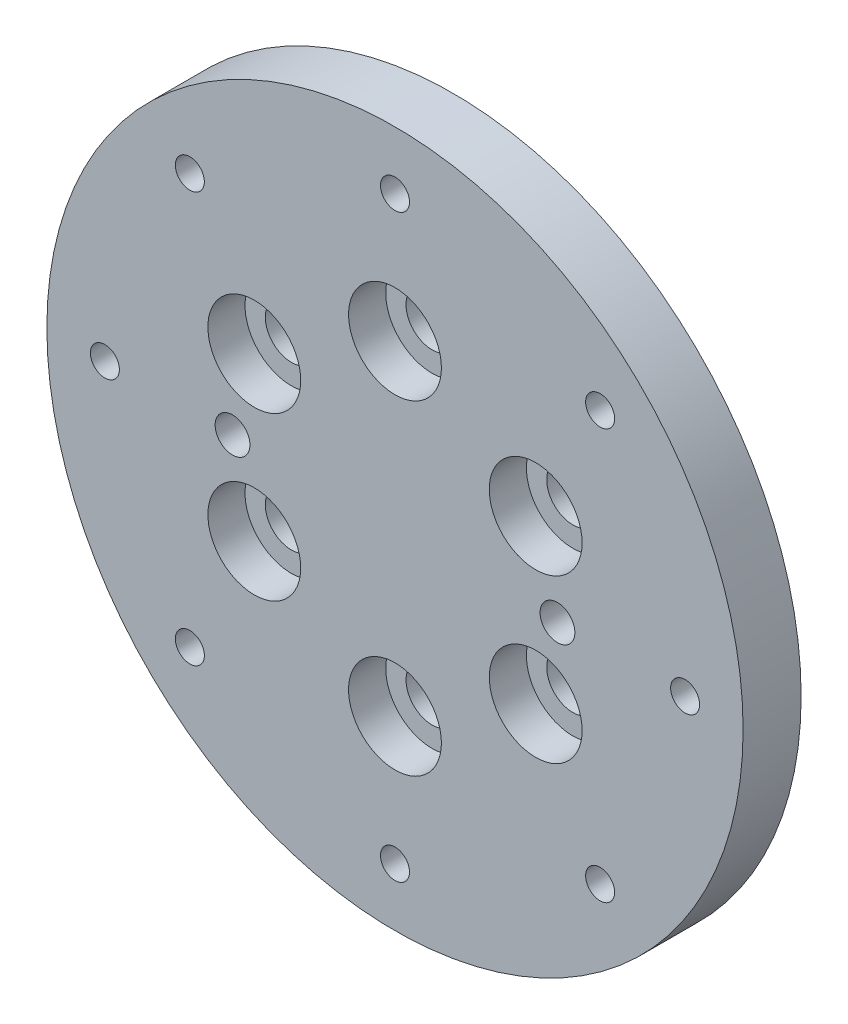
ISO-10303-21;
HEADER;
FILE_DESCRIPTION(('STEP AP214'),'2;1');
FILE_NAME('part.step','',(''),(''),'','','');
FILE_SCHEMA(('AUTOMOTIVE_DESIGN { 1 0 10303 214 1 1 1 1 }'));
ENDSEC;
DATA;
#1=APPLICATION_CONTEXT('core data for automotive mechanical design processes');
#2=APPLICATION_PROTOCOL_DEFINITION('international standard','automotive_design',2000,#1);
#3=PRODUCT_CONTEXT('',#1,'mechanical');
#4=PRODUCT('Part','Part','',(#3));
#5=PRODUCT_RELATED_PRODUCT_CATEGORY('part','',(#4));
#6=PRODUCT_DEFINITION_FORMATION('','',#4);
#7=PRODUCT_DEFINITION_CONTEXT('part definition',#1,'design');
#8=PRODUCT_DEFINITION('design','',#6,#7);
#9=PRODUCT_DEFINITION_SHAPE('','',#8);
#10=(LENGTH_UNIT() NAMED_UNIT(*) SI_UNIT(.MILLI.,.METRE.));
#11=(NAMED_UNIT(*) PLANE_ANGLE_UNIT() SI_UNIT($,.RADIAN.));
#12=(NAMED_UNIT(*) SI_UNIT($,.STERADIAN.) SOLID_ANGLE_UNIT());
#13=UNCERTAINTY_MEASURE_WITH_UNIT(LENGTH_MEASURE(1.E-05),#10,'distance_accuracy_value','');
#14=(GEOMETRIC_REPRESENTATION_CONTEXT(3) GLOBAL_UNCERTAINTY_ASSIGNED_CONTEXT((#13)) GLOBAL_UNIT_ASSIGNED_CONTEXT((#10,
#11,#12)) REPRESENTATION_CONTEXT('',''));
#15=CARTESIAN_POINT('',(0.,0.,0.));
#16=DIRECTION('',(0.,0.,1.));
#17=DIRECTION('',(1.,0.,0.));
#18=AXIS2_PLACEMENT_3D('',#15,#16,#17);
#19=CARTESIAN_POINT('',(0.,0.,5.));
#20=DIRECTION('',(0.,0.,-1.));
#21=DIRECTION('',(-1.,0.,0.));
#22=AXIS2_PLACEMENT_3D('',#19,#20,#21);
#23=CYLINDRICAL_SURFACE('',#22,30.);
#24=CARTESIAN_POINT('',(0.,0.,5.));
#25=DIRECTION('',(0.,0.,1.));
#26=DIRECTION('',(1.,0.,0.));
#27=AXIS2_PLACEMENT_3D('',#24,#25,#26);
#28=CIRCLE('',#27,30.);
#29=CARTESIAN_POINT('',(30.,0.,5.));
#30=VERTEX_POINT('',#29);
#31=EDGE_CURVE('E10',#30,#30,#28,.T.);
#32=ORIENTED_EDGE('',*,*,#31,.F.);
#33=EDGE_LOOP('',(#32));
#34=FACE_BOUND('',#33,.T.);
#35=CARTESIAN_POINT('',(0.,0.,0.));
#36=DIRECTION('',(0.,0.,1.));
#37=DIRECTION('',(1.,0.,0.));
#38=AXIS2_PLACEMENT_3D('',#35,#36,#37);
#39=CIRCLE('',#38,30.);
#40=CARTESIAN_POINT('',(30.,0.,0.));
#41=VERTEX_POINT('',#40);
#42=EDGE_CURVE('E46',#41,#41,#39,.T.);
#43=ORIENTED_EDGE('',*,*,#42,.T.);
#44=EDGE_LOOP('',(#43));
#45=FACE_BOUND('',#44,.T.);
#46=ADVANCED_FACE('F43',(#34,#45),#23,.T.);
#47=CARTESIAN_POINT('',(0.,0.,5.));
#48=DIRECTION('',(0.,0.,1.));
#49=DIRECTION('',(1.,0.,0.));
#50=AXIS2_PLACEMENT_3D('',#47,#48,#49);
#51=PLANE('',#50);
#52=CARTESIAN_POINT('',(0.,25.,5.));
#53=DIRECTION('',(0.,0.,1.));
#54=DIRECTION('',(1.,0.,0.));
#55=AXIS2_PLACEMENT_3D('',#52,#53,#54);
#56=CIRCLE('',#55,1.25);
#57=CARTESIAN_POINT('',(1.25,25.,5.));
#58=VERTEX_POINT('',#57);
#59=EDGE_CURVE('E228',#58,#58,#56,.T.);
#60=ORIENTED_EDGE('',*,*,#59,.F.);
#61=EDGE_LOOP('',(#60));
#62=FACE_BOUND('',#61,.T.);
#63=CARTESIAN_POINT('',(17.677669529664,17.6776695296644,5.));
#64=DIRECTION('',(0.,0.,1.));
#65=DIRECTION('',(1.,0.,0.));
#66=AXIS2_PLACEMENT_3D('',#63,#64,#65);
#67=CIRCLE('',#66,1.25);
#68=CARTESIAN_POINT('',(18.927669529664,17.6776695296644,5.));
#69=VERTEX_POINT('',#68);
#70=EDGE_CURVE('E220',#69,#69,#67,.T.);
#71=ORIENTED_EDGE('',*,*,#70,.F.);
#72=EDGE_LOOP('',(#71));
#73=FACE_BOUND('',#72,.T.);
#74=CARTESIAN_POINT('',(25.0000000000011,1.06122167814335E-12,5.));
#75=DIRECTION('',(0.,0.,1.));
#76=DIRECTION('',(1.,0.,0.));
#77=AXIS2_PLACEMENT_3D('',#74,#75,#76);
#78=CIRCLE('',#77,1.25);
#79=CARTESIAN_POINT('',(26.2500000000011,1.06122167814335E-12,5.));
#80=VERTEX_POINT('',#79);
#81=EDGE_CURVE('E212',#80,#80,#78,.T.);
#82=ORIENTED_EDGE('',*,*,#81,.F.);
#83=EDGE_LOOP('',(#82));
#84=FACE_BOUND('',#83,.T.);
#85=CARTESIAN_POINT('',(17.6776695296655,-17.6776695296629,5.));
#86=DIRECTION('',(0.,0.,1.));
#87=DIRECTION('',(1.,0.,0.));
#88=AXIS2_PLACEMENT_3D('',#85,#86,#87);
#89=CIRCLE('',#88,1.25);
#90=CARTESIAN_POINT('',(18.9276695296655,-17.6776695296629,5.));
#91=VERTEX_POINT('',#90);
#92=EDGE_CURVE('E204',#91,#91,#89,.T.);
#93=ORIENTED_EDGE('',*,*,#92,.F.);
#94=EDGE_LOOP('',(#93));
#95=FACE_BOUND('',#94,.T.);
#96=CARTESIAN_POINT('',(2.1224433562867E-12,-25.,5.));
#97=DIRECTION('',(0.,0.,1.));
#98=DIRECTION('',(1.,0.,0.));
#99=AXIS2_PLACEMENT_3D('',#96,#97,#98);
#100=CIRCLE('',#99,1.25);
#101=CARTESIAN_POINT('',(1.25000000000212,-25.,5.));
#102=VERTEX_POINT('',#101);
#103=EDGE_CURVE('E196',#102,#102,#100,.T.);
#104=ORIENTED_EDGE('',*,*,#103,.F.);
#105=EDGE_LOOP('',(#104));
#106=FACE_BOUND('',#105,.T.);
#107=CARTESIAN_POINT('',(-17.6776695296619,-17.6776695296644,5.));
#108=DIRECTION('',(0.,0.,1.));
#109=DIRECTION('',(1.,0.,0.));
#110=AXIS2_PLACEMENT_3D('',#107,#108,#109);
#111=CIRCLE('',#110,1.25);
#112=CARTESIAN_POINT('',(-16.4276695296619,-17.6776695296644,5.));
#113=VERTEX_POINT('',#112);
#114=EDGE_CURVE('E188',#113,#113,#111,.T.);
#115=ORIENTED_EDGE('',*,*,#114,.F.);
#116=EDGE_LOOP('',(#115));
#117=FACE_BOUND('',#116,.T.);
#118=CARTESIAN_POINT('',(-24.9999999999989,-1.06428329514122E-12,5.));
#119=DIRECTION('',(0.,0.,1.));
#120=DIRECTION('',(1.,0.,0.));
#121=AXIS2_PLACEMENT_3D('',#118,#119,#120);
#122=CIRCLE('',#121,1.25);
#123=CARTESIAN_POINT('',(-23.7499999999989,-1.06428329514122E-12,5.));
#124=VERTEX_POINT('',#123);
#125=EDGE_CURVE('E180',#124,#124,#122,.T.);
#126=ORIENTED_EDGE('',*,*,#125,.F.);
#127=EDGE_LOOP('',(#126));
#128=FACE_BOUND('',#127,.T.);
#129=CARTESIAN_POINT('',(-17.6776695296634,17.6776695296629,5.));
#130=DIRECTION('',(0.,0.,1.));
#131=DIRECTION('',(1.,0.,0.));
#132=AXIS2_PLACEMENT_3D('',#129,#130,#131);
#133=CIRCLE('',#132,1.25);
#134=CARTESIAN_POINT('',(-16.4276695296634,17.6776695296629,5.));
#135=VERTEX_POINT('',#134);
#136=EDGE_CURVE('E172',#135,#135,#133,.T.);
#137=ORIENTED_EDGE('',*,*,#136,.F.);
#138=EDGE_LOOP('',(#137));
#139=FACE_BOUND('',#138,.T.);
#140=CARTESIAN_POINT('',(-14.,0.,5.));
#141=DIRECTION('',(0.,0.,1.));
#142=DIRECTION('',(1.,0.,0.));
#143=AXIS2_PLACEMENT_3D('',#140,#141,#142);
#144=CIRCLE('',#143,1.5);
#145=CARTESIAN_POINT('',(-12.5,0.,5.));
#146=VERTEX_POINT('',#145);
#147=EDGE_CURVE('E164',#146,#146,#144,.T.);
#148=ORIENTED_EDGE('',*,*,#147,.F.);
#149=EDGE_LOOP('',(#148));
#150=FACE_BOUND('',#149,.T.);
#151=CARTESIAN_POINT('',(14.,0.,5.));
#152=DIRECTION('',(0.,0.,1.));
#153=DIRECTION('',(1.,0.,0.));
#154=AXIS2_PLACEMENT_3D('',#151,#152,#153);
#155=CIRCLE('',#154,1.5);
#156=CARTESIAN_POINT('',(15.5,0.,5.));
#157=VERTEX_POINT('',#156);
#158=EDGE_CURVE('E156',#157,#157,#155,.T.);
#159=ORIENTED_EDGE('',*,*,#158,.F.);
#160=EDGE_LOOP('',(#159));
#161=FACE_BOUND('',#160,.T.);
#162=CARTESIAN_POINT('',(0.,14.,5.));
#163=DIRECTION('',(0.,0.,1.));
#164=DIRECTION('',(1.,0.,0.));
#165=AXIS2_PLACEMENT_3D('',#162,#163,#164);
#166=CIRCLE('',#165,4.);
#167=CARTESIAN_POINT('',(4.,14.,5.));
#168=VERTEX_POINT('',#167);
#169=EDGE_CURVE('E148',#168,#168,#166,.T.);
#170=ORIENTED_EDGE('',*,*,#169,.F.);
#171=EDGE_LOOP('',(#170));
#172=FACE_BOUND('',#171,.T.);
#173=CARTESIAN_POINT('',(12.1243556529824,7.00000000000052,5.));
#174=DIRECTION('',(0.,0.,1.));
#175=DIRECTION('',(1.,0.,0.));
#176=AXIS2_PLACEMENT_3D('',#173,#174,#175);
#177=CIRCLE('',#176,4.);
#178=CARTESIAN_POINT('',(16.1243556529824,7.00000000000052,5.));
#179=VERTEX_POINT('',#178);
#180=EDGE_CURVE('E132',#179,#179,#177,.T.);
#181=ORIENTED_EDGE('',*,*,#180,.F.);
#182=EDGE_LOOP('',(#181));
#183=FACE_BOUND('',#182,.T.);
#184=CARTESIAN_POINT('',(12.124355652983,-6.99999999999948,5.));
#185=DIRECTION('',(0.,0.,1.));
#186=DIRECTION('',(1.,0.,0.));
#187=AXIS2_PLACEMENT_3D('',#184,#185,#186);
#188=CIRCLE('',#187,4.);
#189=CARTESIAN_POINT('',(16.124355652983,-6.99999999999948,5.));
#190=VERTEX_POINT('',#189);
#191=EDGE_CURVE('E116',#190,#190,#188,.T.);
#192=ORIENTED_EDGE('',*,*,#191,.F.);
#193=EDGE_LOOP('',(#192));
#194=FACE_BOUND('',#193,.T.);
#195=CARTESIAN_POINT('',(1.18856827952055E-12,-14.,5.));
#196=DIRECTION('',(0.,0.,1.));
#197=DIRECTION('',(1.,0.,0.));
#198=AXIS2_PLACEMENT_3D('',#195,#196,#197);
#199=CIRCLE('',#198,4.);
#200=CARTESIAN_POINT('',(4.00000000000119,-14.,5.));
#201=VERTEX_POINT('',#200);
#202=EDGE_CURVE('E100',#201,#201,#199,.T.);
#203=ORIENTED_EDGE('',*,*,#202,.F.);
#204=EDGE_LOOP('',(#203));
#205=FACE_BOUND('',#204,.T.);
#206=CARTESIAN_POINT('',(-12.1243556529812,-7.00000000000052,5.));
#207=DIRECTION('',(0.,0.,1.));
#208=DIRECTION('',(1.,0.,0.));
#209=AXIS2_PLACEMENT_3D('',#206,#207,#208);
#210=CIRCLE('',#209,4.);
#211=CARTESIAN_POINT('',(-8.12435565298125,-7.00000000000052,5.));
#212=VERTEX_POINT('',#211);
#213=EDGE_CURVE('E84',#212,#212,#210,.T.);
#214=ORIENTED_EDGE('',*,*,#213,.F.);
#215=EDGE_LOOP('',(#214));
#216=FACE_BOUND('',#215,.T.);
#217=CARTESIAN_POINT('',(-12.1243556529818,6.99999999999949,5.));
#218=DIRECTION('',(0.,0.,1.));
#219=DIRECTION('',(1.,0.,0.));
#220=AXIS2_PLACEMENT_3D('',#217,#218,#219);
#221=CIRCLE('',#220,4.);
#222=CARTESIAN_POINT('',(-8.12435565298185,6.99999999999949,5.));
#223=VERTEX_POINT('',#222);
#224=EDGE_CURVE('E68',#223,#223,#221,.T.);
#225=ORIENTED_EDGE('',*,*,#224,.F.);
#226=EDGE_LOOP('',(#225));
#227=FACE_BOUND('',#226,.T.);
#228=ORIENTED_EDGE('',*,*,#31,.T.);
#229=EDGE_LOOP('',(#228));
#230=FACE_BOUND('',#229,.T.);
#231=ADVANCED_FACE('F235',(#62,#73,#84,#95,#106,#117,#128,#139,#150,#161,#172,#183,#194,#205,
#216,#227,#230),#51,.T.);
#232=CARTESIAN_POINT('',(0.,0.,0.));
#233=DIRECTION('',(0.,0.,1.));
#234=DIRECTION('',(1.,0.,0.));
#235=AXIS2_PLACEMENT_3D('',#232,#233,#234);
#236=PLANE('',#235);
#237=CARTESIAN_POINT('',(0.,25.,0.));
#238=DIRECTION('',(0.,0.,1.));
#239=DIRECTION('',(1.,0.,0.));
#240=AXIS2_PLACEMENT_3D('',#237,#238,#239);
#241=CIRCLE('',#240,1.25);
#242=CARTESIAN_POINT('',(1.25,25.,0.));
#243=VERTEX_POINT('',#242);
#244=EDGE_CURVE('E224',#243,#243,#241,.T.);
#245=ORIENTED_EDGE('',*,*,#244,.T.);
#246=EDGE_LOOP('',(#245));
#247=FACE_BOUND('',#246,.T.);
#248=CARTESIAN_POINT('',(17.677669529664,17.6776695296644,0.));
#249=DIRECTION('',(0.,0.,1.));
#250=DIRECTION('',(1.,0.,0.));
#251=AXIS2_PLACEMENT_3D('',#248,#249,#250);
#252=CIRCLE('',#251,1.25);
#253=CARTESIAN_POINT('',(18.927669529664,17.6776695296644,0.));
#254=VERTEX_POINT('',#253);
#255=EDGE_CURVE('E216',#254,#254,#252,.T.);
#256=ORIENTED_EDGE('',*,*,#255,.T.);
#257=EDGE_LOOP('',(#256));
#258=FACE_BOUND('',#257,.T.);
#259=CARTESIAN_POINT('',(25.0000000000011,1.06122167814335E-12,0.));
#260=DIRECTION('',(0.,0.,1.));
#261=DIRECTION('',(1.,0.,0.));
#262=AXIS2_PLACEMENT_3D('',#259,#260,#261);
#263=CIRCLE('',#262,1.25);
#264=CARTESIAN_POINT('',(26.2500000000011,1.06122167814335E-12,0.));
#265=VERTEX_POINT('',#264);
#266=EDGE_CURVE('E208',#265,#265,#263,.T.);
#267=ORIENTED_EDGE('',*,*,#266,.T.);
#268=EDGE_LOOP('',(#267));
#269=FACE_BOUND('',#268,.T.);
#270=CARTESIAN_POINT('',(17.6776695296655,-17.6776695296629,0.));
#271=DIRECTION('',(0.,0.,1.));
#272=DIRECTION('',(1.,0.,0.));
#273=AXIS2_PLACEMENT_3D('',#270,#271,#272);
#274=CIRCLE('',#273,1.25);
#275=CARTESIAN_POINT('',(18.9276695296655,-17.6776695296629,0.));
#276=VERTEX_POINT('',#275);
#277=EDGE_CURVE('E200',#276,#276,#274,.T.);
#278=ORIENTED_EDGE('',*,*,#277,.T.);
#279=EDGE_LOOP('',(#278));
#280=FACE_BOUND('',#279,.T.);
#281=CARTESIAN_POINT('',(2.1224433562867E-12,-25.,0.));
#282=DIRECTION('',(0.,0.,1.));
#283=DIRECTION('',(1.,0.,0.));
#284=AXIS2_PLACEMENT_3D('',#281,#282,#283);
#285=CIRCLE('',#284,1.25);
#286=CARTESIAN_POINT('',(1.25000000000212,-25.,0.));
#287=VERTEX_POINT('',#286);
#288=EDGE_CURVE('E192',#287,#287,#285,.T.);
#289=ORIENTED_EDGE('',*,*,#288,.T.);
#290=EDGE_LOOP('',(#289));
#291=FACE_BOUND('',#290,.T.);
#292=CARTESIAN_POINT('',(-17.6776695296619,-17.6776695296644,0.));
#293=DIRECTION('',(0.,0.,1.));
#294=DIRECTION('',(1.,0.,0.));
#295=AXIS2_PLACEMENT_3D('',#292,#293,#294);
#296=CIRCLE('',#295,1.25);
#297=CARTESIAN_POINT('',(-16.4276695296619,-17.6776695296644,0.));
#298=VERTEX_POINT('',#297);
#299=EDGE_CURVE('E184',#298,#298,#296,.T.);
#300=ORIENTED_EDGE('',*,*,#299,.T.);
#301=EDGE_LOOP('',(#300));
#302=FACE_BOUND('',#301,.T.);
#303=CARTESIAN_POINT('',(-24.9999999999989,-1.06428329514122E-12,0.));
#304=DIRECTION('',(0.,0.,1.));
#305=DIRECTION('',(1.,0.,0.));
#306=AXIS2_PLACEMENT_3D('',#303,#304,#305);
#307=CIRCLE('',#306,1.25);
#308=CARTESIAN_POINT('',(-23.7499999999989,-1.06428329514122E-12,0.));
#309=VERTEX_POINT('',#308);
#310=EDGE_CURVE('E176',#309,#309,#307,.T.);
#311=ORIENTED_EDGE('',*,*,#310,.T.);
#312=EDGE_LOOP('',(#311));
#313=FACE_BOUND('',#312,.T.);
#314=CARTESIAN_POINT('',(-17.6776695296634,17.6776695296629,0.));
#315=DIRECTION('',(0.,0.,1.));
#316=DIRECTION('',(1.,0.,0.));
#317=AXIS2_PLACEMENT_3D('',#314,#315,#316);
#318=CIRCLE('',#317,1.25);
#319=CARTESIAN_POINT('',(-16.4276695296634,17.6776695296629,0.));
#320=VERTEX_POINT('',#319);
#321=EDGE_CURVE('E168',#320,#320,#318,.T.);
#322=ORIENTED_EDGE('',*,*,#321,.T.);
#323=EDGE_LOOP('',(#322));
#324=FACE_BOUND('',#323,.T.);
#325=CARTESIAN_POINT('',(-14.,0.,0.));
#326=DIRECTION('',(0.,0.,1.));
#327=DIRECTION('',(1.,0.,0.));
#328=AXIS2_PLACEMENT_3D('',#325,#326,#327);
#329=CIRCLE('',#328,1.5);
#330=CARTESIAN_POINT('',(-12.5,0.,0.));
#331=VERTEX_POINT('',#330);
#332=EDGE_CURVE('E160',#331,#331,#329,.T.);
#333=ORIENTED_EDGE('',*,*,#332,.T.);
#334=EDGE_LOOP('',(#333));
#335=FACE_BOUND('',#334,.T.);
#336=CARTESIAN_POINT('',(14.,0.,0.));
#337=DIRECTION('',(0.,0.,1.));
#338=DIRECTION('',(1.,0.,0.));
#339=AXIS2_PLACEMENT_3D('',#336,#337,#338);
#340=CIRCLE('',#339,1.5);
#341=CARTESIAN_POINT('',(15.5,0.,0.));
#342=VERTEX_POINT('',#341);
#343=EDGE_CURVE('E152',#342,#342,#340,.T.);
#344=ORIENTED_EDGE('',*,*,#343,.T.);
#345=EDGE_LOOP('',(#344));
#346=FACE_BOUND('',#345,.T.);
#347=CARTESIAN_POINT('',(0.,14.,0.));
#348=DIRECTION('',(0.,0.,1.));
#349=DIRECTION('',(1.,0.,0.));
#350=AXIS2_PLACEMENT_3D('',#347,#348,#349);
#351=CIRCLE('',#350,2.25);
#352=CARTESIAN_POINT('',(2.25,14.,0.));
#353=VERTEX_POINT('',#352);
#354=EDGE_CURVE('E136',#353,#353,#351,.T.);
#355=ORIENTED_EDGE('',*,*,#354,.T.);
#356=EDGE_LOOP('',(#355));
#357=FACE_BOUND('',#356,.T.);
#358=CARTESIAN_POINT('',(12.1243556529824,7.00000000000052,0.));
#359=DIRECTION('',(0.,0.,1.));
#360=DIRECTION('',(1.,0.,0.));
#361=AXIS2_PLACEMENT_3D('',#358,#359,#360);
#362=CIRCLE('',#361,2.25);
#363=CARTESIAN_POINT('',(14.3743556529824,7.00000000000052,0.));
#364=VERTEX_POINT('',#363);
#365=EDGE_CURVE('E120',#364,#364,#362,.T.);
#366=ORIENTED_EDGE('',*,*,#365,.T.);
#367=EDGE_LOOP('',(#366));
#368=FACE_BOUND('',#367,.T.);
#369=CARTESIAN_POINT('',(12.124355652983,-6.99999999999948,0.));
#370=DIRECTION('',(0.,0.,1.));
#371=DIRECTION('',(1.,0.,0.));
#372=AXIS2_PLACEMENT_3D('',#369,#370,#371);
#373=CIRCLE('',#372,2.25);
#374=CARTESIAN_POINT('',(14.374355652983,-6.99999999999948,0.));
#375=VERTEX_POINT('',#374);
#376=EDGE_CURVE('E104',#375,#375,#373,.T.);
#377=ORIENTED_EDGE('',*,*,#376,.T.);
#378=EDGE_LOOP('',(#377));
#379=FACE_BOUND('',#378,.T.);
#380=CARTESIAN_POINT('',(1.18856827952055E-12,-14.,0.));
#381=DIRECTION('',(0.,0.,1.));
#382=DIRECTION('',(1.,0.,0.));
#383=AXIS2_PLACEMENT_3D('',#380,#381,#382);
#384=CIRCLE('',#383,2.25);
#385=CARTESIAN_POINT('',(2.25000000000119,-14.,0.));
#386=VERTEX_POINT('',#385);
#387=EDGE_CURVE('E88',#386,#386,#384,.T.);
#388=ORIENTED_EDGE('',*,*,#387,.T.);
#389=EDGE_LOOP('',(#388));
#390=FACE_BOUND('',#389,.T.);
#391=CARTESIAN_POINT('',(-12.1243556529812,-7.00000000000052,0.));
#392=DIRECTION('',(0.,0.,1.));
#393=DIRECTION('',(1.,0.,0.));
#394=AXIS2_PLACEMENT_3D('',#391,#392,#393);
#395=CIRCLE('',#394,2.25);
#396=CARTESIAN_POINT('',(-9.87435565298125,-7.00000000000052,0.));
#397=VERTEX_POINT('',#396);
#398=EDGE_CURVE('E72',#397,#397,#395,.T.);
#399=ORIENTED_EDGE('',*,*,#398,.T.);
#400=EDGE_LOOP('',(#399));
#401=FACE_BOUND('',#400,.T.);
#402=CARTESIAN_POINT('',(-12.1243556529818,6.99999999999949,0.));
#403=DIRECTION('',(0.,0.,1.));
#404=DIRECTION('',(1.,0.,0.));
#405=AXIS2_PLACEMENT_3D('',#402,#403,#404);
#406=CIRCLE('',#405,2.25);
#407=CARTESIAN_POINT('',(-9.87435565298185,6.99999999999949,0.));
#408=VERTEX_POINT('',#407);
#409=EDGE_CURVE('E55',#408,#408,#406,.T.);
#410=ORIENTED_EDGE('',*,*,#409,.T.);
#411=EDGE_LOOP('',(#410));
#412=FACE_BOUND('',#411,.T.);
#413=ORIENTED_EDGE('',*,*,#42,.F.);
#414=EDGE_LOOP('',(#413));
#415=FACE_BOUND('',#414,.T.);
#416=ADVANCED_FACE('F238',(#247,#258,#269,#280,#291,#302,#313,#324,#335,#346,#357,#368,#379,
#390,#401,#412,#415),#236,.F.);
#417=CARTESIAN_POINT('',(-12.1243556529818,6.99999999999949,5.));
#418=DIRECTION('',(0.,0.,1.));
#419=DIRECTION('',(1.,0.,0.));
#420=AXIS2_PLACEMENT_3D('',#417,#418,#419);
#421=CYLINDRICAL_SURFACE('',#420,2.25);
#422=ORIENTED_EDGE('',*,*,#409,.F.);
#423=EDGE_LOOP('',(#422));
#424=FACE_BOUND('',#423,.T.);
#425=CARTESIAN_POINT('',(-12.1243556529818,6.99999999999949,1.8));
#426=DIRECTION('',(0.,0.,1.));
#427=DIRECTION('',(1.,0.,0.));
#428=AXIS2_PLACEMENT_3D('',#425,#426,#427);
#429=CIRCLE('',#428,2.25);
#430=CARTESIAN_POINT('',(-9.87435565298185,6.99999999999949,1.8));
#431=VERTEX_POINT('',#430);
#432=EDGE_CURVE('E60',#431,#431,#429,.T.);
#433=ORIENTED_EDGE('',*,*,#432,.T.);
#434=EDGE_LOOP('',(#433));
#435=FACE_BOUND('',#434,.T.);
#436=ADVANCED_FACE('F283',(#424,#435),#421,.F.);
#437=CARTESIAN_POINT('',(-9.87435565298185,6.99999999999949,1.8));
#438=DIRECTION('',(0.,0.,-1.));
#439=DIRECTION('',(-1.,0.,0.));
#440=AXIS2_PLACEMENT_3D('',#437,#438,#439);
#441=PLANE('',#440);
#442=ORIENTED_EDGE('',*,*,#432,.F.);
#443=EDGE_LOOP('',(#442));
#444=FACE_BOUND('',#443,.T.);
#445=CARTESIAN_POINT('',(-12.1243556529818,6.99999999999949,1.8));
#446=DIRECTION('',(0.,0.,1.));
#447=DIRECTION('',(1.,0.,0.));
#448=AXIS2_PLACEMENT_3D('',#445,#446,#447);
#449=CIRCLE('',#448,4.);
#450=CARTESIAN_POINT('',(-8.12435565298185,6.99999999999949,1.8));
#451=VERTEX_POINT('',#450);
#452=EDGE_CURVE('E64',#451,#451,#449,.T.);
#453=ORIENTED_EDGE('',*,*,#452,.T.);
#454=EDGE_LOOP('',(#453));
#455=FACE_BOUND('',#454,.T.);
#456=ADVANCED_FACE('F273',(#444,#455),#441,.F.);
#457=CARTESIAN_POINT('',(-12.1243556529818,6.99999999999949,5.));
#458=DIRECTION('',(0.,0.,1.));
#459=DIRECTION('',(1.,0.,0.));
#460=AXIS2_PLACEMENT_3D('',#457,#458,#459);
#461=CYLINDRICAL_SURFACE('',#460,4.);
#462=ORIENTED_EDGE('',*,*,#452,.F.);
#463=EDGE_LOOP('',(#462));
#464=FACE_BOUND('',#463,.T.);
#465=ORIENTED_EDGE('',*,*,#224,.T.);
#466=EDGE_LOOP('',(#465));
#467=FACE_BOUND('',#466,.T.);
#468=ADVANCED_FACE('F270',(#464,#467),#461,.F.);
#469=CARTESIAN_POINT('',(-12.1243556529812,-7.00000000000052,5.));
#470=DIRECTION('',(0.,0.,1.));
#471=DIRECTION('',(1.,0.,0.));
#472=AXIS2_PLACEMENT_3D('',#469,#470,#471);
#473=CYLINDRICAL_SURFACE('',#472,2.25);
#474=ORIENTED_EDGE('',*,*,#398,.F.);
#475=EDGE_LOOP('',(#474));
#476=FACE_BOUND('',#475,.T.);
#477=CARTESIAN_POINT('',(-12.1243556529812,-7.00000000000052,1.8));
#478=DIRECTION('',(0.,0.,1.));
#479=DIRECTION('',(1.,0.,0.));
#480=AXIS2_PLACEMENT_3D('',#477,#478,#479);
#481=CIRCLE('',#480,2.25);
#482=CARTESIAN_POINT('',(-9.87435565298125,-7.00000000000052,1.8));
#483=VERTEX_POINT('',#482);
#484=EDGE_CURVE('E76',#483,#483,#481,.T.);
#485=ORIENTED_EDGE('',*,*,#484,.T.);
#486=EDGE_LOOP('',(#485));
#487=FACE_BOUND('',#486,.T.);
#488=ADVANCED_FACE('F272',(#476,#487),#473,.F.);
#489=CARTESIAN_POINT('',(-9.87435565298125,-7.00000000000052,1.8));
#490=DIRECTION('',(0.,0.,-1.));
#491=DIRECTION('',(-1.,0.,0.));
#492=AXIS2_PLACEMENT_3D('',#489,#490,#491);
#493=PLANE('',#492);
#494=ORIENTED_EDGE('',*,*,#484,.F.);
#495=EDGE_LOOP('',(#494));
#496=FACE_BOUND('',#495,.T.);
#497=CARTESIAN_POINT('',(-12.1243556529812,-7.00000000000052,1.8));
#498=DIRECTION('',(0.,0.,1.));
#499=DIRECTION('',(1.,0.,0.));
#500=AXIS2_PLACEMENT_3D('',#497,#498,#499);
#501=CIRCLE('',#500,4.);
#502=CARTESIAN_POINT('',(-8.12435565298125,-7.00000000000052,1.8));
#503=VERTEX_POINT('',#502);
#504=EDGE_CURVE('E80',#503,#503,#501,.T.);
#505=ORIENTED_EDGE('',*,*,#504,.T.);
#506=EDGE_LOOP('',(#505));
#507=FACE_BOUND('',#506,.T.);
#508=ADVANCED_FACE('F280',(#496,#507),#493,.F.);
#509=CARTESIAN_POINT('',(-12.1243556529812,-7.00000000000052,5.));
#510=DIRECTION('',(0.,0.,1.));
#511=DIRECTION('',(1.,0.,0.));
#512=AXIS2_PLACEMENT_3D('',#509,#510,#511);
#513=CYLINDRICAL_SURFACE('',#512,4.);
#514=ORIENTED_EDGE('',*,*,#504,.F.);
#515=EDGE_LOOP('',(#514));
#516=FACE_BOUND('',#515,.T.);
#517=ORIENTED_EDGE('',*,*,#213,.T.);
#518=EDGE_LOOP('',(#517));
#519=FACE_BOUND('',#518,.T.);
#520=ADVANCED_FACE('F341',(#516,#519),#513,.F.);
#521=CARTESIAN_POINT('',(1.18856827952055E-12,-14.,5.));
#522=DIRECTION('',(0.,0.,1.));
#523=DIRECTION('',(1.,0.,0.));
#524=AXIS2_PLACEMENT_3D('',#521,#522,#523);
#525=CYLINDRICAL_SURFACE('',#524,2.25);
#526=ORIENTED_EDGE('',*,*,#387,.F.);
#527=EDGE_LOOP('',(#526));
#528=FACE_BOUND('',#527,.T.);
#529=CARTESIAN_POINT('',(1.18856827952055E-12,-14.,1.8));
#530=DIRECTION('',(0.,0.,1.));
#531=DIRECTION('',(1.,0.,0.));
#532=AXIS2_PLACEMENT_3D('',#529,#530,#531);
#533=CIRCLE('',#532,2.25);
#534=CARTESIAN_POINT('',(2.25000000000119,-14.,1.8));
#535=VERTEX_POINT('',#534);
#536=EDGE_CURVE('E92',#535,#535,#533,.T.);
#537=ORIENTED_EDGE('',*,*,#536,.T.);
#538=EDGE_LOOP('',(#537));
#539=FACE_BOUND('',#538,.T.);
#540=ADVANCED_FACE('F347',(#528,#539),#525,.F.);
#541=CARTESIAN_POINT('',(2.25000000000119,-14.,1.8));
#542=DIRECTION('',(0.,0.,-1.));
#543=DIRECTION('',(-1.,0.,0.));
#544=AXIS2_PLACEMENT_3D('',#541,#542,#543);
#545=PLANE('',#544);
#546=ORIENTED_EDGE('',*,*,#536,.F.);
#547=EDGE_LOOP('',(#546));
#548=FACE_BOUND('',#547,.T.);
#549=CARTESIAN_POINT('',(1.18856827952055E-12,-14.,1.8));
#550=DIRECTION('',(0.,0.,1.));
#551=DIRECTION('',(1.,0.,0.));
#552=AXIS2_PLACEMENT_3D('',#549,#550,#551);
#553=CIRCLE('',#552,4.);
#554=CARTESIAN_POINT('',(4.00000000000119,-14.,1.8));
#555=VERTEX_POINT('',#554);
#556=EDGE_CURVE('E96',#555,#555,#553,.T.);
#557=ORIENTED_EDGE('',*,*,#556,.T.);
#558=EDGE_LOOP('',(#557));
#559=FACE_BOUND('',#558,.T.);
#560=ADVANCED_FACE('F352',(#548,#559),#545,.F.);
#561=CARTESIAN_POINT('',(1.18856827952055E-12,-14.,5.));
#562=DIRECTION('',(0.,0.,1.));
#563=DIRECTION('',(1.,0.,0.));
#564=AXIS2_PLACEMENT_3D('',#561,#562,#563);
#565=CYLINDRICAL_SURFACE('',#564,4.);
#566=ORIENTED_EDGE('',*,*,#556,.F.);
#567=EDGE_LOOP('',(#566));
#568=FACE_BOUND('',#567,.T.);
#569=ORIENTED_EDGE('',*,*,#202,.T.);
#570=EDGE_LOOP('',(#569));
#571=FACE_BOUND('',#570,.T.);
#572=ADVANCED_FACE('F358',(#568,#571),#565,.F.);
#573=CARTESIAN_POINT('',(12.124355652983,-6.99999999999948,5.));
#574=DIRECTION('',(0.,0.,1.));
#575=DIRECTION('',(1.,0.,0.));
#576=AXIS2_PLACEMENT_3D('',#573,#574,#575);
#577=CYLINDRICAL_SURFACE('',#576,2.25);
#578=ORIENTED_EDGE('',*,*,#376,.F.);
#579=EDGE_LOOP('',(#578));
#580=FACE_BOUND('',#579,.T.);
#581=CARTESIAN_POINT('',(12.124355652983,-6.99999999999948,1.8));
#582=DIRECTION('',(0.,0.,1.));
#583=DIRECTION('',(1.,0.,0.));
#584=AXIS2_PLACEMENT_3D('',#581,#582,#583);
#585=CIRCLE('',#584,2.25);
#586=CARTESIAN_POINT('',(14.374355652983,-6.99999999999948,1.8));
#587=VERTEX_POINT('',#586);
#588=EDGE_CURVE('E108',#587,#587,#585,.T.);
#589=ORIENTED_EDGE('',*,*,#588,.T.);
#590=EDGE_LOOP('',(#589));
#591=FACE_BOUND('',#590,.T.);
#592=ADVANCED_FACE('F362',(#580,#591),#577,.F.);
#593=CARTESIAN_POINT('',(14.374355652983,-6.99999999999948,1.8));
#594=DIRECTION('',(0.,0.,-1.));
#595=DIRECTION('',(-1.,0.,0.));
#596=AXIS2_PLACEMENT_3D('',#593,#594,#595);
#597=PLANE('',#596);
#598=ORIENTED_EDGE('',*,*,#588,.F.);
#599=EDGE_LOOP('',(#598));
#600=FACE_BOUND('',#599,.T.);
#601=CARTESIAN_POINT('',(12.124355652983,-6.99999999999948,1.8));
#602=DIRECTION('',(0.,0.,1.));
#603=DIRECTION('',(1.,0.,0.));
#604=AXIS2_PLACEMENT_3D('',#601,#602,#603);
#605=CIRCLE('',#604,4.);
#606=CARTESIAN_POINT('',(16.124355652983,-6.99999999999948,1.8));
#607=VERTEX_POINT('',#606);
#608=EDGE_CURVE('E112',#607,#607,#605,.T.);
#609=ORIENTED_EDGE('',*,*,#608,.T.);
#610=EDGE_LOOP('',(#609));
#611=FACE_BOUND('',#610,.T.);
#612=ADVANCED_FACE('F366',(#600,#611),#597,.F.);
#613=CARTESIAN_POINT('',(12.124355652983,-6.99999999999948,5.));
#614=DIRECTION('',(0.,0.,1.));
#615=DIRECTION('',(1.,0.,0.));
#616=AXIS2_PLACEMENT_3D('',#613,#614,#615);
#617=CYLINDRICAL_SURFACE('',#616,4.);
#618=ORIENTED_EDGE('',*,*,#608,.F.);
#619=EDGE_LOOP('',(#618));
#620=FACE_BOUND('',#619,.T.);
#621=ORIENTED_EDGE('',*,*,#191,.T.);
#622=EDGE_LOOP('',(#621));
#623=FACE_BOUND('',#622,.T.);
#624=ADVANCED_FACE('F370',(#620,#623),#617,.F.);
#625=CARTESIAN_POINT('',(12.1243556529824,7.00000000000052,5.));
#626=DIRECTION('',(0.,0.,1.));
#627=DIRECTION('',(1.,0.,0.));
#628=AXIS2_PLACEMENT_3D('',#625,#626,#627);
#629=CYLINDRICAL_SURFACE('',#628,2.25);
#630=ORIENTED_EDGE('',*,*,#365,.F.);
#631=EDGE_LOOP('',(#630));
#632=FACE_BOUND('',#631,.T.);
#633=CARTESIAN_POINT('',(12.1243556529824,7.00000000000052,1.8));
#634=DIRECTION('',(0.,0.,1.));
#635=DIRECTION('',(1.,0.,0.));
#636=AXIS2_PLACEMENT_3D('',#633,#634,#635);
#637=CIRCLE('',#636,2.25);
#638=CARTESIAN_POINT('',(14.3743556529824,7.00000000000052,1.8));
#639=VERTEX_POINT('',#638);
#640=EDGE_CURVE('E124',#639,#639,#637,.T.);
#641=ORIENTED_EDGE('',*,*,#640,.T.);
#642=EDGE_LOOP('',(#641));
#643=FACE_BOUND('',#642,.T.);
#644=ADVANCED_FACE('F374',(#632,#643),#629,.F.);
#645=CARTESIAN_POINT('',(14.3743556529824,7.00000000000052,1.8));
#646=DIRECTION('',(0.,0.,-1.));
#647=DIRECTION('',(-1.,0.,0.));
#648=AXIS2_PLACEMENT_3D('',#645,#646,#647);
#649=PLANE('',#648);
#650=ORIENTED_EDGE('',*,*,#640,.F.);
#651=EDGE_LOOP('',(#650));
#652=FACE_BOUND('',#651,.T.);
#653=CARTESIAN_POINT('',(12.1243556529824,7.00000000000052,1.8));
#654=DIRECTION('',(0.,0.,1.));
#655=DIRECTION('',(1.,0.,0.));
#656=AXIS2_PLACEMENT_3D('',#653,#654,#655);
#657=CIRCLE('',#656,4.);
#658=CARTESIAN_POINT('',(16.1243556529824,7.00000000000052,1.8));
#659=VERTEX_POINT('',#658);
#660=EDGE_CURVE('E128',#659,#659,#657,.T.);
#661=ORIENTED_EDGE('',*,*,#660,.T.);
#662=EDGE_LOOP('',(#661));
#663=FACE_BOUND('',#662,.T.);
#664=ADVANCED_FACE('F378',(#652,#663),#649,.F.);
#665=CARTESIAN_POINT('',(12.1243556529824,7.00000000000052,5.));
#666=DIRECTION('',(0.,0.,1.));
#667=DIRECTION('',(1.,0.,0.));
#668=AXIS2_PLACEMENT_3D('',#665,#666,#667);
#669=CYLINDRICAL_SURFACE('',#668,4.);
#670=ORIENTED_EDGE('',*,*,#660,.F.);
#671=EDGE_LOOP('',(#670));
#672=FACE_BOUND('',#671,.T.);
#673=ORIENTED_EDGE('',*,*,#180,.T.);
#674=EDGE_LOOP('',(#673));
#675=FACE_BOUND('',#674,.T.);
#676=ADVANCED_FACE('F382',(#672,#675),#669,.F.);
#677=CARTESIAN_POINT('',(0.,14.,5.));
#678=DIRECTION('',(0.,0.,1.));
#679=DIRECTION('',(1.,0.,0.));
#680=AXIS2_PLACEMENT_3D('',#677,#678,#679);
#681=CYLINDRICAL_SURFACE('',#680,2.25);
#682=ORIENTED_EDGE('',*,*,#354,.F.);
#683=EDGE_LOOP('',(#682));
#684=FACE_BOUND('',#683,.T.);
#685=CARTESIAN_POINT('',(0.,14.,1.8));
#686=DIRECTION('',(0.,0.,1.));
#687=DIRECTION('',(1.,0.,0.));
#688=AXIS2_PLACEMENT_3D('',#685,#686,#687);
#689=CIRCLE('',#688,2.25);
#690=CARTESIAN_POINT('',(2.25,14.,1.8));
#691=VERTEX_POINT('',#690);
#692=EDGE_CURVE('E140',#691,#691,#689,.T.);
#693=ORIENTED_EDGE('',*,*,#692,.T.);
#694=EDGE_LOOP('',(#693));
#695=FACE_BOUND('',#694,.T.);
#696=ADVANCED_FACE('F386',(#684,#695),#681,.F.);
#697=CARTESIAN_POINT('',(2.25,14.,1.8));
#698=DIRECTION('',(0.,0.,-1.));
#699=DIRECTION('',(-1.,0.,0.));
#700=AXIS2_PLACEMENT_3D('',#697,#698,#699);
#701=PLANE('',#700);
#702=ORIENTED_EDGE('',*,*,#692,.F.);
#703=EDGE_LOOP('',(#702));
#704=FACE_BOUND('',#703,.T.);
#705=CARTESIAN_POINT('',(0.,14.,1.8));
#706=DIRECTION('',(0.,0.,1.));
#707=DIRECTION('',(1.,0.,0.));
#708=AXIS2_PLACEMENT_3D('',#705,#706,#707);
#709=CIRCLE('',#708,4.);
#710=CARTESIAN_POINT('',(4.,14.,1.8));
#711=VERTEX_POINT('',#710);
#712=EDGE_CURVE('E144',#711,#711,#709,.T.);
#713=ORIENTED_EDGE('',*,*,#712,.T.);
#714=EDGE_LOOP('',(#713));
#715=FACE_BOUND('',#714,.T.);
#716=ADVANCED_FACE('F390',(#704,#715),#701,.F.);
#717=CARTESIAN_POINT('',(0.,14.,5.));
#718=DIRECTION('',(0.,0.,1.));
#719=DIRECTION('',(1.,0.,0.));
#720=AXIS2_PLACEMENT_3D('',#717,#718,#719);
#721=CYLINDRICAL_SURFACE('',#720,4.);
#722=ORIENTED_EDGE('',*,*,#712,.F.);
#723=EDGE_LOOP('',(#722));
#724=FACE_BOUND('',#723,.T.);
#725=ORIENTED_EDGE('',*,*,#169,.T.);
#726=EDGE_LOOP('',(#725));
#727=FACE_BOUND('',#726,.T.);
#728=ADVANCED_FACE('F394',(#724,#727),#721,.F.);
#729=CARTESIAN_POINT('',(14.,0.,5.));
#730=DIRECTION('',(0.,0.,1.));
#731=DIRECTION('',(1.,0.,0.));
#732=AXIS2_PLACEMENT_3D('',#729,#730,#731);
#733=CYLINDRICAL_SURFACE('',#732,1.5);
#734=ORIENTED_EDGE('',*,*,#343,.F.);
#735=EDGE_LOOP('',(#734));
#736=FACE_BOUND('',#735,.T.);
#737=ORIENTED_EDGE('',*,*,#158,.T.);
#738=EDGE_LOOP('',(#737));
#739=FACE_BOUND('',#738,.T.);
#740=ADVANCED_FACE('F398',(#736,#739),#733,.F.);
#741=CARTESIAN_POINT('',(-14.,0.,5.));
#742=DIRECTION('',(0.,0.,1.));
#743=DIRECTION('',(1.,0.,0.));
#744=AXIS2_PLACEMENT_3D('',#741,#742,#743);
#745=CYLINDRICAL_SURFACE('',#744,1.5);
#746=ORIENTED_EDGE('',*,*,#332,.F.);
#747=EDGE_LOOP('',(#746));
#748=FACE_BOUND('',#747,.T.);
#749=ORIENTED_EDGE('',*,*,#147,.T.);
#750=EDGE_LOOP('',(#749));
#751=FACE_BOUND('',#750,.T.);
#752=ADVANCED_FACE('F402',(#748,#751),#745,.F.);
#753=CARTESIAN_POINT('',(-17.6776695296634,17.6776695296629,5.));
#754=DIRECTION('',(0.,0.,1.));
#755=DIRECTION('',(1.,0.,0.));
#756=AXIS2_PLACEMENT_3D('',#753,#754,#755);
#757=CYLINDRICAL_SURFACE('',#756,1.25);
#758=ORIENTED_EDGE('',*,*,#321,.F.);
#759=EDGE_LOOP('',(#758));
#760=FACE_BOUND('',#759,.T.);
#761=ORIENTED_EDGE('',*,*,#136,.T.);
#762=EDGE_LOOP('',(#761));
#763=FACE_BOUND('',#762,.T.);
#764=ADVANCED_FACE('F406',(#760,#763),#757,.F.);
#765=CARTESIAN_POINT('',(-24.9999999999989,-1.06428329514122E-12,5.));
#766=DIRECTION('',(0.,0.,1.));
#767=DIRECTION('',(1.,0.,0.));
#768=AXIS2_PLACEMENT_3D('',#765,#766,#767);
#769=CYLINDRICAL_SURFACE('',#768,1.25);
#770=ORIENTED_EDGE('',*,*,#310,.F.);
#771=EDGE_LOOP('',(#770));
#772=FACE_BOUND('',#771,.T.);
#773=ORIENTED_EDGE('',*,*,#125,.T.);
#774=EDGE_LOOP('',(#773));
#775=FACE_BOUND('',#774,.T.);
#776=ADVANCED_FACE('F409',(#772,#775),#769,.F.);
#777=CARTESIAN_POINT('',(-17.6776695296619,-17.6776695296644,5.));
#778=DIRECTION('',(0.,0.,1.));
#779=DIRECTION('',(1.,0.,0.));
#780=AXIS2_PLACEMENT_3D('',#777,#778,#779);
#781=CYLINDRICAL_SURFACE('',#780,1.25);
#782=ORIENTED_EDGE('',*,*,#299,.F.);
#783=EDGE_LOOP('',(#782));
#784=FACE_BOUND('',#783,.T.);
#785=ORIENTED_EDGE('',*,*,#114,.T.);
#786=EDGE_LOOP('',(#785));
#787=FACE_BOUND('',#786,.T.);
#788=ADVANCED_FACE('F413',(#784,#787),#781,.F.);
#789=CARTESIAN_POINT('',(2.1224433562867E-12,-25.,5.));
#790=DIRECTION('',(0.,0.,1.));
#791=DIRECTION('',(1.,0.,0.));
#792=AXIS2_PLACEMENT_3D('',#789,#790,#791);
#793=CYLINDRICAL_SURFACE('',#792,1.25);
#794=ORIENTED_EDGE('',*,*,#288,.F.);
#795=EDGE_LOOP('',(#794));
#796=FACE_BOUND('',#795,.T.);
#797=ORIENTED_EDGE('',*,*,#103,.T.);
#798=EDGE_LOOP('',(#797));
#799=FACE_BOUND('',#798,.T.);
#800=ADVANCED_FACE('F417',(#796,#799),#793,.F.);
#801=CARTESIAN_POINT('',(17.6776695296655,-17.6776695296629,5.));
#802=DIRECTION('',(0.,0.,1.));
#803=DIRECTION('',(1.,0.,0.));
#804=AXIS2_PLACEMENT_3D('',#801,#802,#803);
#805=CYLINDRICAL_SURFACE('',#804,1.25);
#806=ORIENTED_EDGE('',*,*,#277,.F.);
#807=EDGE_LOOP('',(#806));
#808=FACE_BOUND('',#807,.T.);
#809=ORIENTED_EDGE('',*,*,#92,.T.);
#810=EDGE_LOOP('',(#809));
#811=FACE_BOUND('',#810,.T.);
#812=ADVANCED_FACE('F421',(#808,#811),#805,.F.);
#813=CARTESIAN_POINT('',(25.0000000000011,1.06122167814335E-12,5.));
#814=DIRECTION('',(0.,0.,1.));
#815=DIRECTION('',(1.,0.,0.));
#816=AXIS2_PLACEMENT_3D('',#813,#814,#815);
#817=CYLINDRICAL_SURFACE('',#816,1.25);
#818=ORIENTED_EDGE('',*,*,#266,.F.);
#819=EDGE_LOOP('',(#818));
#820=FACE_BOUND('',#819,.T.);
#821=ORIENTED_EDGE('',*,*,#81,.T.);
#822=EDGE_LOOP('',(#821));
#823=FACE_BOUND('',#822,.T.);
#824=ADVANCED_FACE('F425',(#820,#823),#817,.F.);
#825=CARTESIAN_POINT('',(17.677669529664,17.6776695296644,5.));
#826=DIRECTION('',(0.,0.,1.));
#827=DIRECTION('',(1.,0.,0.));
#828=AXIS2_PLACEMENT_3D('',#825,#826,#827);
#829=CYLINDRICAL_SURFACE('',#828,1.25);
#830=ORIENTED_EDGE('',*,*,#255,.F.);
#831=EDGE_LOOP('',(#830));
#832=FACE_BOUND('',#831,.T.);
#833=ORIENTED_EDGE('',*,*,#70,.T.);
#834=EDGE_LOOP('',(#833));
#835=FACE_BOUND('',#834,.T.);
#836=ADVANCED_FACE('F429',(#832,#835),#829,.F.);
#837=CARTESIAN_POINT('',(0.,25.,5.));
#838=DIRECTION('',(0.,0.,1.));
#839=DIRECTION('',(1.,0.,0.));
#840=AXIS2_PLACEMENT_3D('',#837,#838,#839);
#841=CYLINDRICAL_SURFACE('',#840,1.25);
#842=ORIENTED_EDGE('',*,*,#244,.F.);
#843=EDGE_LOOP('',(#842));
#844=FACE_BOUND('',#843,.T.);
#845=ORIENTED_EDGE('',*,*,#59,.T.);
#846=EDGE_LOOP('',(#845));
#847=FACE_BOUND('',#846,.T.);
#848=ADVANCED_FACE('F233',(#844,#847),#841,.F.);
#849=CLOSED_SHELL('',(#46,#231,#416,#436,#456,#468,#488,#508,#520,#540,#560,#572,#592,#612,#624,
#644,#664,#676,#696,#716,#728,#740,#752,#764,#776,#788,#800,#812,#824,#836,#848));
#850=MANIFOLD_SOLID_BREP('B2',#849);
#851=ADVANCED_BREP_SHAPE_REPRESENTATION('',(#18,#850),#14);
#852=SHAPE_DEFINITION_REPRESENTATION(#9,#851);
ENDSEC;
END-ISO-10303-21;
